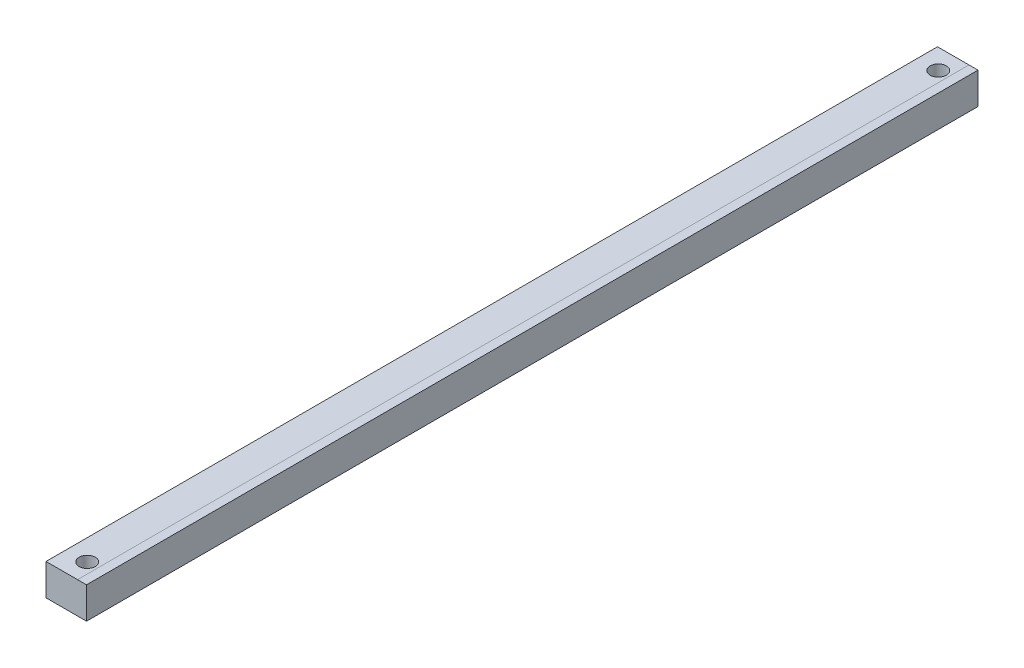
ISO-10303-21;
HEADER;
FILE_DESCRIPTION(('STEP AP214'),'2;1');
FILE_NAME('part.step','',(''),(''),'','','');
FILE_SCHEMA(('AUTOMOTIVE_DESIGN { 1 0 10303 214 1 1 1 1 }'));
ENDSEC;
DATA;
#1=APPLICATION_CONTEXT('core data for automotive mechanical design processes');
#2=APPLICATION_PROTOCOL_DEFINITION('international standard','automotive_design',2000,#1);
#3=PRODUCT_CONTEXT('',#1,'mechanical');
#4=PRODUCT('Part','Part','',(#3));
#5=PRODUCT_RELATED_PRODUCT_CATEGORY('part','',(#4));
#6=PRODUCT_DEFINITION_FORMATION('','',#4);
#7=PRODUCT_DEFINITION_CONTEXT('part definition',#1,'design');
#8=PRODUCT_DEFINITION('design','',#6,#7);
#9=PRODUCT_DEFINITION_SHAPE('','',#8);
#10=(LENGTH_UNIT() NAMED_UNIT(*) SI_UNIT(.MILLI.,.METRE.));
#11=(NAMED_UNIT(*) PLANE_ANGLE_UNIT() SI_UNIT($,.RADIAN.));
#12=(NAMED_UNIT(*) SI_UNIT($,.STERADIAN.) SOLID_ANGLE_UNIT());
#13=UNCERTAINTY_MEASURE_WITH_UNIT(LENGTH_MEASURE(1.E-05),#10,'distance_accuracy_value','');
#14=(GEOMETRIC_REPRESENTATION_CONTEXT(3) GLOBAL_UNCERTAINTY_ASSIGNED_CONTEXT((#13)) GLOBAL_UNIT_ASSIGNED_CONTEXT((#10,
#11,#12)) REPRESENTATION_CONTEXT('',''));
#15=CARTESIAN_POINT('',(0.,0.,0.));
#16=DIRECTION('',(0.,0.,1.));
#17=DIRECTION('',(1.,0.,0.));
#18=AXIS2_PLACEMENT_3D('',#15,#16,#17);
#19=CARTESIAN_POINT('',(1.38791770062322,-0.0883401352825959,198.));
#20=DIRECTION('',(-0.000887411036566035,0.999999606250749,0.));
#21=DIRECTION('',(-0.999999606250749,-0.000887411036566035,0.));
#22=AXIS2_PLACEMENT_3D('',#19,#20,#21);
#23=PLANE('',#22);
#24=DIRECTION('',(0.,0.,-1.));
#25=VECTOR('',#24,1.);
#26=CARTESIAN_POINT('',(196.387840919519,0.0847050168477808,198.));
#27=LINE('',#26,#25);
#28=CARTESIAN_POINT('',(196.387840919519,0.0847050168477808,191.618123404125));
#29=VERTEX_POINT('',#28);
#30=CARTESIAN_POINT('',(196.387840919519,0.0847050168477808,6.38187659587451));
#31=VERTEX_POINT('',#30);
#32=EDGE_CURVE('E115',#29,#31,#27,.T.);
#33=ORIENTED_EDGE('',*,*,#32,.F.);
#34=CARTESIAN_POINT('',(194.058366516258,0.082637814738968,193.508505569516));
#35=DIRECTION('',(0.000887411036566035,-0.999999606250749,0.));
#36=DIRECTION('',(0.999999606250749,0.000887411036566035,0.));
#37=AXIS2_PLACEMENT_3D('',#34,#35,#36);
#38=CIRCLE('',#37,3.);
#39=CARTESIAN_POINT('',(196.387840919519,0.0847050168477791,195.398887734907));
#40=VERTEX_POINT('',#39);
#41=EDGE_CURVE('E52',#40,#29,#38,.T.);
#42=ORIENTED_EDGE('',*,*,#41,.F.);
#43=CARTESIAN_POINT('',(196.387840919519,0.0847050168477808,198.));
#44=VERTEX_POINT('',#43);
#45=EDGE_CURVE('E114',#44,#40,#27,.T.);
#46=ORIENTED_EDGE('',*,*,#45,.F.);
#47=DIRECTION('',(0.999999606250748,0.000887411036566035,0.));
#48=VECTOR('',#47,1.);
#49=CARTESIAN_POINT('',(1.38791770062322,-0.0883401352825959,198.));
#50=LINE('',#49,#48);
#51=CARTESIAN_POINT('',(189.387840919519,0.0784931371458956,198.));
#52=VERTEX_POINT('',#51);
#53=EDGE_CURVE('E136',#52,#44,#50,.T.);
#54=ORIENTED_EDGE('',*,*,#53,.F.);
#55=DIRECTION('',(0.,0.,1.));
#56=VECTOR('',#55,1.);
#57=CARTESIAN_POINT('',(189.387840919519,0.0784931371458956,198.));
#58=LINE('',#57,#56);
#59=CARTESIAN_POINT('',(189.387840919519,0.0784931371458956,0.));
#60=VERTEX_POINT('',#59);
#61=EDGE_CURVE('E200',#60,#52,#58,.T.);
#62=ORIENTED_EDGE('',*,*,#61,.F.);
#63=DIRECTION('',(0.999999606250748,0.000887411036566035,0.));
#64=VECTOR('',#63,1.);
#65=CARTESIAN_POINT('',(1.38791770062322,-0.0883401352825959,0.));
#66=LINE('',#65,#64);
#67=CARTESIAN_POINT('',(196.387840919519,0.0847050168477808,0.));
#68=VERTEX_POINT('',#67);
#69=EDGE_CURVE('E140',#60,#68,#66,.T.);
#70=ORIENTED_EDGE('',*,*,#69,.T.);
#71=CARTESIAN_POINT('',(196.387840919519,0.0847050168477791,2.60111226509298));
#72=VERTEX_POINT('',#71);
#73=EDGE_CURVE('E117',#72,#68,#27,.T.);
#74=ORIENTED_EDGE('',*,*,#73,.F.);
#75=CARTESIAN_POINT('',(194.058366516258,0.082637814738968,4.49149443048374));
#76=DIRECTION('',(0.000887411036566035,-0.999999606250749,0.));
#77=DIRECTION('',(0.999999606250749,0.000887411036566035,0.));
#78=AXIS2_PLACEMENT_3D('',#75,#76,#77);
#79=CIRCLE('',#78,3.);
#80=EDGE_CURVE('E167',#31,#72,#79,.T.);
#81=ORIENTED_EDGE('',*,*,#80,.F.);
#82=EDGE_LOOP('',(#33,#42,#46,#54,#62,#70,#74,#81));
#83=FACE_BOUND('',#82,.T.);
#84=ADVANCED_FACE('F37',(#83),#23,.F.);
#85=CARTESIAN_POINT('',(-0.00613239029291217,6.91042552503994,0.));
#86=DIRECTION('',(-0.000887411036566035,0.999999606250749,0.));
#87=DIRECTION('',(-0.999999606250749,-0.000887411036566035,0.));
#88=AXIS2_PLACEMENT_3D('',#85,#86,#87);
#89=PLANE('',#88);
#90=CARTESIAN_POINT('',(194.052154639002,7.08263505849421,193.508505569516));
#91=DIRECTION('',(-0.000887411036566035,0.999999606250749,0.));
#92=DIRECTION('',(-0.999999606250749,-0.000887411036566035,0.));
#93=AXIS2_PLACEMENT_3D('',#90,#91,#92);
#94=CIRCLE('',#93,1.8);
#95=CARTESIAN_POINT('',(192.252155347751,7.0810377186284,193.508505569516));
#96=VERTEX_POINT('',#95);
#97=EDGE_CURVE('E41',#96,#96,#94,.T.);
#98=ORIENTED_EDGE('',*,*,#97,.F.);
#99=EDGE_LOOP('',(#98));
#100=FACE_BOUND('',#99,.T.);
#101=CARTESIAN_POINT('',(194.052154639002,7.08263505849421,4.49149443048374));
#102=DIRECTION('',(-0.000887411036566035,0.999999606250749,0.));
#103=DIRECTION('',(-0.999999606250749,-0.000887411036566035,0.));
#104=AXIS2_PLACEMENT_3D('',#101,#102,#103);
#105=CIRCLE('',#104,1.79999999999999);
#106=CARTESIAN_POINT('',(192.252155347751,7.0810377186284,4.49149443048374));
#107=VERTEX_POINT('',#106);
#108=EDGE_CURVE('E158',#107,#107,#105,.T.);
#109=ORIENTED_EDGE('',*,*,#108,.F.);
#110=EDGE_LOOP('',(#109));
#111=FACE_BOUND('',#110,.T.);
#112=DIRECTION('',(0.,0.,-1.));
#113=VECTOR('',#112,1.);
#114=CARTESIAN_POINT('',(189.387840919519,7.07849589339174,198.));
#115=LINE('',#114,#113);
#116=CARTESIAN_POINT('',(189.387840919519,7.07849589339175,198.));
#117=VERTEX_POINT('',#116);
#118=CARTESIAN_POINT('',(189.387840919519,7.07849589339175,0.));
#119=VERTEX_POINT('',#118);
#120=EDGE_CURVE('E46',#117,#119,#115,.T.);
#121=ORIENTED_EDGE('',*,*,#120,.F.);
#122=DIRECTION('',(0.999999606250749,0.000887411036566035,0.));
#123=VECTOR('',#122,1.);
#124=CARTESIAN_POINT('',(-0.00613239029291217,6.91042552503994,198.));
#125=LINE('',#124,#123);
#126=CARTESIAN_POINT('',(196.387840919519,7.08470777309363,198.));
#127=VERTEX_POINT('',#126);
#128=EDGE_CURVE('E147',#117,#127,#125,.T.);
#129=ORIENTED_EDGE('',*,*,#128,.T.);
#130=DIRECTION('',(0.,0.,-1.));
#131=VECTOR('',#130,1.);
#132=CARTESIAN_POINT('',(196.387840919519,7.08470777309363,198.));
#133=LINE('',#132,#131);
#134=CARTESIAN_POINT('',(196.387840919519,7.08470777309363,0.));
#135=VERTEX_POINT('',#134);
#136=EDGE_CURVE('E201',#127,#135,#133,.T.);
#137=ORIENTED_EDGE('',*,*,#136,.T.);
#138=DIRECTION('',(0.999999606250749,0.000887411036566035,0.));
#139=VECTOR('',#138,1.);
#140=CARTESIAN_POINT('',(-0.00613239029291217,6.91042552503994,0.));
#141=LINE('',#140,#139);
#142=EDGE_CURVE('E128',#119,#135,#141,.T.);
#143=ORIENTED_EDGE('',*,*,#142,.F.);
#144=EDGE_LOOP('',(#121,#129,#137,#143));
#145=FACE_BOUND('',#144,.T.);
#146=ADVANCED_FACE('F184',(#100,#111,#145),#89,.T.);
#147=CARTESIAN_POINT('',(189.387840919519,0.,0.));
#148=DIRECTION('',(-1.,0.,0.));
#149=DIRECTION('',(0.,0.,1.));
#150=AXIS2_PLACEMENT_3D('',#147,#148,#149);
#151=PLANE('',#150);
#152=ORIENTED_EDGE('',*,*,#61,.T.);
#153=DIRECTION('',(0.,1.,0.));
#154=VECTOR('',#153,1.);
#155=CARTESIAN_POINT('',(189.387840919519,0.,198.));
#156=LINE('',#155,#154);
#157=EDGE_CURVE('E198',#52,#117,#156,.T.);
#158=ORIENTED_EDGE('',*,*,#157,.T.);
#159=ORIENTED_EDGE('',*,*,#120,.T.);
#160=DIRECTION('',(0.,1.,0.));
#161=VECTOR('',#160,1.);
#162=CARTESIAN_POINT('',(189.387840919519,0.,0.));
#163=LINE('',#162,#161);
#164=EDGE_CURVE('E130',#60,#119,#163,.T.);
#165=ORIENTED_EDGE('',*,*,#164,.F.);
#166=EDGE_LOOP('',(#152,#158,#159,#165));
#167=FACE_BOUND('',#166,.T.);
#168=ADVANCED_FACE('F39',(#167),#151,.T.);
#169=CARTESIAN_POINT('',(0.,0.,0.));
#170=DIRECTION('',(0.,0.,-1.));
#171=DIRECTION('',(-1.,0.,0.));
#172=AXIS2_PLACEMENT_3D('',#169,#170,#171);
#173=PLANE('',#172);
#174=DIRECTION('',(1.,0.,0.));
#175=VECTOR('',#174,1.);
#176=CARTESIAN_POINT('',(189.387840919519,0.0784927547504464,0.));
#177=LINE('',#176,#175);
#178=CARTESIAN_POINT('',(196.387840919519,0.0784927547504464,0.));
#179=VERTEX_POINT('',#178);
#180=CARTESIAN_POINT('',(198.387840919519,0.0784927547504464,0.));
#181=VERTEX_POINT('',#180);
#182=EDGE_CURVE('E174',#179,#181,#177,.T.);
#183=ORIENTED_EDGE('',*,*,#182,.F.);
#184=DIRECTION('',(0.,1.,0.));
#185=VECTOR('',#184,1.);
#186=CARTESIAN_POINT('',(196.387840919519,-0.0484672452495536,0.));
#187=LINE('',#186,#185);
#188=EDGE_CURVE('E154',#179,#68,#187,.T.);
#189=ORIENTED_EDGE('',*,*,#188,.T.);
#190=ORIENTED_EDGE('',*,*,#69,.F.);
#191=ORIENTED_EDGE('',*,*,#164,.T.);
#192=ORIENTED_EDGE('',*,*,#142,.T.);
#193=DIRECTION('',(-1.,0.,0.));
#194=VECTOR('',#193,1.);
#195=CARTESIAN_POINT('',(198.387840919519,7.08470777309363,0.));
#196=LINE('',#195,#194);
#197=CARTESIAN_POINT('',(198.387840919519,7.08470777309363,0.));
#198=VERTEX_POINT('',#197);
#199=EDGE_CURVE('E144',#198,#135,#196,.T.);
#200=ORIENTED_EDGE('',*,*,#199,.F.);
#201=DIRECTION('',(0.,1.,0.));
#202=VECTOR('',#201,1.);
#203=CARTESIAN_POINT('',(198.387840919519,-0.0484672452495536,0.));
#204=LINE('',#203,#202);
#205=EDGE_CURVE('E160',#181,#198,#204,.T.);
#206=ORIENTED_EDGE('',*,*,#205,.F.);
#207=EDGE_LOOP('',(#183,#189,#190,#191,#192,#200,#206));
#208=FACE_BOUND('',#207,.T.);
#209=ADVANCED_FACE('F226',(#208),#173,.T.);
#210=CARTESIAN_POINT('',(0.,0.,198.));
#211=DIRECTION('',(0.,0.,-1.));
#212=DIRECTION('',(-1.,0.,0.));
#213=AXIS2_PLACEMENT_3D('',#210,#211,#212);
#214=PLANE('',#213);
#215=DIRECTION('',(0.,-1.,0.));
#216=VECTOR('',#215,1.);
#217=CARTESIAN_POINT('',(196.387840919519,-0.0484672452495536,198.));
#218=LINE('',#217,#216);
#219=CARTESIAN_POINT('',(196.387840919519,0.0784927547504463,198.));
#220=VERTEX_POINT('',#219);
#221=EDGE_CURVE('E127',#44,#220,#218,.T.);
#222=ORIENTED_EDGE('',*,*,#221,.T.);
#223=DIRECTION('',(-1.,0.,0.));
#224=VECTOR('',#223,1.);
#225=CARTESIAN_POINT('',(189.387840919519,0.0784927547504464,198.));
#226=LINE('',#225,#224);
#227=CARTESIAN_POINT('',(198.387840919519,0.0784927547504464,198.));
#228=VERTEX_POINT('',#227);
#229=EDGE_CURVE('E59',#228,#220,#226,.T.);
#230=ORIENTED_EDGE('',*,*,#229,.F.);
#231=DIRECTION('',(0.,-1.,0.));
#232=VECTOR('',#231,1.);
#233=CARTESIAN_POINT('',(198.387840919519,-0.0484672452495536,198.));
#234=LINE('',#233,#232);
#235=CARTESIAN_POINT('',(198.387840919519,7.08470777309363,198.));
#236=VERTEX_POINT('',#235);
#237=EDGE_CURVE('E156',#236,#228,#234,.T.);
#238=ORIENTED_EDGE('',*,*,#237,.F.);
#239=DIRECTION('',(-1.,0.,0.));
#240=VECTOR('',#239,1.);
#241=CARTESIAN_POINT('',(198.387840919519,7.08470777309363,198.));
#242=LINE('',#241,#240);
#243=EDGE_CURVE('E150',#236,#127,#242,.T.);
#244=ORIENTED_EDGE('',*,*,#243,.T.);
#245=ORIENTED_EDGE('',*,*,#128,.F.);
#246=ORIENTED_EDGE('',*,*,#157,.F.);
#247=ORIENTED_EDGE('',*,*,#53,.T.);
#248=EDGE_LOOP('',(#222,#230,#238,#244,#245,#246,#247));
#249=FACE_BOUND('',#248,.T.);
#250=ADVANCED_FACE('F203',(#249),#214,.F.);
#251=CARTESIAN_POINT('',(198.387840919519,7.08470777309363,198.));
#252=DIRECTION('',(0.,-1.,0.));
#253=DIRECTION('',(0.,0.,-1.));
#254=AXIS2_PLACEMENT_3D('',#251,#252,#253);
#255=PLANE('',#254);
#256=ORIENTED_EDGE('',*,*,#136,.F.);
#257=ORIENTED_EDGE('',*,*,#243,.F.);
#258=DIRECTION('',(0.,0.,1.));
#259=VECTOR('',#258,1.);
#260=CARTESIAN_POINT('',(198.387840919519,7.08470777309363,198.));
#261=LINE('',#260,#259);
#262=EDGE_CURVE('E153',#198,#236,#261,.T.);
#263=ORIENTED_EDGE('',*,*,#262,.F.);
#264=ORIENTED_EDGE('',*,*,#199,.T.);
#265=EDGE_LOOP('',(#256,#257,#263,#264));
#266=FACE_BOUND('',#265,.T.);
#267=ADVANCED_FACE('F234',(#266),#255,.F.);
#268=CARTESIAN_POINT('',(198.387840919519,0.,0.));
#269=DIRECTION('',(-1.,0.,0.));
#270=DIRECTION('',(0.,0.,1.));
#271=AXIS2_PLACEMENT_3D('',#268,#269,#270);
#272=PLANE('',#271);
#273=ORIENTED_EDGE('',*,*,#237,.T.);
#274=DIRECTION('',(0.,0.,1.));
#275=VECTOR('',#274,1.);
#276=CARTESIAN_POINT('',(198.387840919519,0.0784927547504464,0.));
#277=LINE('',#276,#275);
#278=EDGE_CURVE('E172',#181,#228,#277,.T.);
#279=ORIENTED_EDGE('',*,*,#278,.F.);
#280=ORIENTED_EDGE('',*,*,#205,.T.);
#281=ORIENTED_EDGE('',*,*,#262,.T.);
#282=EDGE_LOOP('',(#273,#279,#280,#281));
#283=FACE_BOUND('',#282,.T.);
#284=ADVANCED_FACE('F230',(#283),#272,.F.);
#285=CARTESIAN_POINT('',(196.387840919519,0.,0.));
#286=DIRECTION('',(-1.,0.,0.));
#287=DIRECTION('',(0.,0.,1.));
#288=AXIS2_PLACEMENT_3D('',#285,#286,#287);
#289=PLANE('',#288);
#290=DIRECTION('',(0.,0.,-1.));
#291=VECTOR('',#290,1.);
#292=CARTESIAN_POINT('',(196.387840919519,0.0784927547504464,0.));
#293=LINE('',#292,#291);
#294=EDGE_CURVE('E11',#220,#179,#293,.T.);
#295=ORIENTED_EDGE('',*,*,#294,.F.);
#296=ORIENTED_EDGE('',*,*,#221,.F.);
#297=ORIENTED_EDGE('',*,*,#45,.T.);
#298=EDGE_CURVE('E108',#40,#29,#27,.T.);
#299=ORIENTED_EDGE('',*,*,#298,.T.);
#300=ORIENTED_EDGE('',*,*,#32,.T.);
#301=EDGE_CURVE('E129',#31,#72,#27,.T.);
#302=ORIENTED_EDGE('',*,*,#301,.T.);
#303=ORIENTED_EDGE('',*,*,#73,.T.);
#304=ORIENTED_EDGE('',*,*,#188,.F.);
#305=EDGE_LOOP('',(#295,#296,#297,#299,#300,#302,#303,#304));
#306=FACE_BOUND('',#305,.T.);
#307=ADVANCED_FACE('F125',(#306),#289,.T.);
#308=CARTESIAN_POINT('',(194.058366516258,0.0826378147389688,7.49149443048374));
#309=DIRECTION('',(0.000887411036566035,-0.999999606250749,0.));
#310=DIRECTION('',(0.999999606250749,0.000887411036566035,0.));
#311=AXIS2_PLACEMENT_3D('',#308,#309,#310);
#312=PLANE('',#311);
#313=ORIENTED_EDGE('',*,*,#301,.F.);
#314=EDGE_CURVE('E170',#72,#31,#79,.T.);
#315=ORIENTED_EDGE('',*,*,#314,.F.);
#316=EDGE_LOOP('',(#313,#315));
#317=FACE_BOUND('',#316,.T.);
#318=ADVANCED_FACE('F214',(#317),#312,.F.);
#319=CARTESIAN_POINT('',(194.058366516258,0.0826378147389697,4.49149443048374));
#320=DIRECTION('',(0.000887411036566035,-0.999999606250749,0.));
#321=DIRECTION('',(0.999999606250749,0.000887411036566035,0.));
#322=AXIS2_PLACEMENT_3D('',#319,#320,#321);
#323=CYLINDRICAL_SURFACE('',#322,1.79999999999999);
#324=ORIENTED_EDGE('',*,*,#108,.T.);
#325=EDGE_LOOP('',(#324));
#326=FACE_BOUND('',#325,.T.);
#327=CARTESIAN_POINT('',(194.057338160806,1.24146388822038,4.49149443048374));
#328=DIRECTION('',(0.000887411036566035,-0.999999606250749,0.));
#329=DIRECTION('',(0.999999606250749,0.000887411036566035,0.));
#330=AXIS2_PLACEMENT_3D('',#327,#328,#329);
#331=CIRCLE('',#330,1.8);
#332=CARTESIAN_POINT('',(195.857337452058,1.2430612280862,4.49149443048374));
#333=VERTEX_POINT('',#332);
#334=EDGE_CURVE('E164',#333,#333,#331,.T.);
#335=ORIENTED_EDGE('',*,*,#334,.T.);
#336=EDGE_LOOP('',(#335));
#337=FACE_BOUND('',#336,.T.);
#338=ADVANCED_FACE('F210',(#326,#337),#323,.F.);
#339=CARTESIAN_POINT('',(194.058366516258,0.082637814738968,4.49149443048374));
#340=DIRECTION('',(0.000887411036566035,-0.999999606250749,0.));
#341=DIRECTION('',(0.999999606250749,0.000887411036566035,0.));
#342=AXIS2_PLACEMENT_3D('',#339,#340,#341);
#343=CONICAL_SURFACE('',#342,3.,0.80285145591739);
#344=ORIENTED_EDGE('',*,*,#334,.F.);
#345=EDGE_LOOP('',(#344));
#346=FACE_BOUND('',#345,.T.);
#347=ORIENTED_EDGE('',*,*,#80,.T.);
#348=ORIENTED_EDGE('',*,*,#314,.T.);
#349=EDGE_LOOP('',(#347,#348));
#350=FACE_BOUND('',#349,.T.);
#351=ADVANCED_FACE('F213',(#346,#350),#343,.F.);
#352=CARTESIAN_POINT('',(0.,0.0784927547504464,0.));
#353=DIRECTION('',(0.,1.,0.));
#354=DIRECTION('',(0.,0.,1.));
#355=AXIS2_PLACEMENT_3D('',#352,#353,#354);
#356=PLANE('',#355);
#357=ORIENTED_EDGE('',*,*,#294,.T.);
#358=ORIENTED_EDGE('',*,*,#182,.T.);
#359=ORIENTED_EDGE('',*,*,#278,.T.);
#360=ORIENTED_EDGE('',*,*,#229,.T.);
#361=EDGE_LOOP('',(#357,#358,#359,#360));
#362=FACE_BOUND('',#361,.T.);
#363=ADVANCED_FACE('F220',(#362),#356,.F.);
#364=CARTESIAN_POINT('',(194.058366516258,0.0826378147389688,196.508505569516));
#365=DIRECTION('',(0.000887411036566035,-0.999999606250749,0.));
#366=DIRECTION('',(0.999999606250749,0.000887411036566035,0.));
#367=AXIS2_PLACEMENT_3D('',#364,#365,#366);
#368=PLANE('',#367);
#369=ORIENTED_EDGE('',*,*,#298,.F.);
#370=EDGE_CURVE('E110',#29,#40,#38,.T.);
#371=ORIENTED_EDGE('',*,*,#370,.F.);
#372=EDGE_LOOP('',(#369,#371));
#373=FACE_BOUND('',#372,.T.);
#374=ADVANCED_FACE('F109',(#373),#368,.F.);
#375=CARTESIAN_POINT('',(194.058366516258,0.0826378147389697,193.508505569516));
#376=DIRECTION('',(0.000887411036566035,-0.999999606250749,0.));
#377=DIRECTION('',(0.999999606250749,0.000887411036566035,0.));
#378=AXIS2_PLACEMENT_3D('',#375,#376,#377);
#379=CYLINDRICAL_SURFACE('',#378,1.8);
#380=ORIENTED_EDGE('',*,*,#97,.T.);
#381=EDGE_LOOP('',(#380));
#382=FACE_BOUND('',#381,.T.);
#383=CARTESIAN_POINT('',(194.057338160806,1.24146388822038,193.508505569516));
#384=DIRECTION('',(0.000887411036566035,-0.999999606250749,0.));
#385=DIRECTION('',(0.999999606250749,0.000887411036566035,0.));
#386=AXIS2_PLACEMENT_3D('',#383,#384,#385);
#387=CIRCLE('',#386,1.8);
#388=CARTESIAN_POINT('',(195.857337452058,1.2430612280862,193.508505569516));
#389=VERTEX_POINT('',#388);
#390=EDGE_CURVE('E124',#389,#389,#387,.T.);
#391=ORIENTED_EDGE('',*,*,#390,.T.);
#392=EDGE_LOOP('',(#391));
#393=FACE_BOUND('',#392,.T.);
#394=ADVANCED_FACE('F182',(#382,#393),#379,.F.);
#395=CARTESIAN_POINT('',(194.058366516258,0.082637814738968,193.508505569516));
#396=DIRECTION('',(0.000887411036566035,-0.999999606250749,0.));
#397=DIRECTION('',(0.999999606250749,0.000887411036566035,0.));
#398=AXIS2_PLACEMENT_3D('',#395,#396,#397);
#399=CONICAL_SURFACE('',#398,3.,0.802851455917392);
#400=ORIENTED_EDGE('',*,*,#390,.F.);
#401=EDGE_LOOP('',(#400));
#402=FACE_BOUND('',#401,.T.);
#403=ORIENTED_EDGE('',*,*,#41,.T.);
#404=ORIENTED_EDGE('',*,*,#370,.T.);
#405=EDGE_LOOP('',(#403,#404));
#406=FACE_BOUND('',#405,.T.);
#407=ADVANCED_FACE('F118',(#402,#406),#399,.F.);
#408=CLOSED_SHELL('',(#84,#146,#168,#209,#250,#267,#284,#307,#318,#338,#351,#363,#374,#394,#407));
#409=MANIFOLD_SOLID_BREP('B2',#408);
#410=ADVANCED_BREP_SHAPE_REPRESENTATION('',(#18,#409),#14);
#411=SHAPE_DEFINITION_REPRESENTATION(#9,#410);
ENDSEC;
END-ISO-10303-21;
